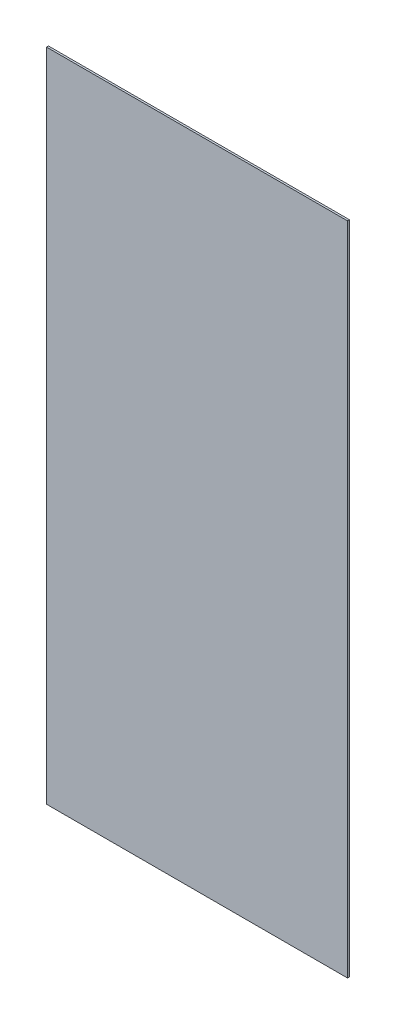
ISO-10303-21;
HEADER;
FILE_DESCRIPTION(('STEP AP214'),'2;1');
FILE_NAME('part.step','',(''),(''),'','','');
FILE_SCHEMA(('AUTOMOTIVE_DESIGN { 1 0 10303 214 1 1 1 1 }'));
ENDSEC;
DATA;
#1=APPLICATION_CONTEXT('core data for automotive mechanical design processes');
#2=APPLICATION_PROTOCOL_DEFINITION('international standard','automotive_design',2000,#1);
#3=PRODUCT_CONTEXT('',#1,'mechanical');
#4=PRODUCT('Part','Part','',(#3));
#5=PRODUCT_RELATED_PRODUCT_CATEGORY('part','',(#4));
#6=PRODUCT_DEFINITION_FORMATION('','',#4);
#7=PRODUCT_DEFINITION_CONTEXT('part definition',#1,'design');
#8=PRODUCT_DEFINITION('design','',#6,#7);
#9=PRODUCT_DEFINITION_SHAPE('','',#8);
#10=(LENGTH_UNIT() NAMED_UNIT(*) SI_UNIT(.MILLI.,.METRE.));
#11=(NAMED_UNIT(*) PLANE_ANGLE_UNIT() SI_UNIT($,.RADIAN.));
#12=(NAMED_UNIT(*) SI_UNIT($,.STERADIAN.) SOLID_ANGLE_UNIT());
#13=UNCERTAINTY_MEASURE_WITH_UNIT(LENGTH_MEASURE(1.E-05),#10,'distance_accuracy_value','');
#14=(GEOMETRIC_REPRESENTATION_CONTEXT(3) GLOBAL_UNCERTAINTY_ASSIGNED_CONTEXT((#13)) GLOBAL_UNIT_ASSIGNED_CONTEXT((#10,
#11,#12)) REPRESENTATION_CONTEXT('',''));
#15=CARTESIAN_POINT('',(0.,0.,0.));
#16=DIRECTION('',(0.,0.,1.));
#17=DIRECTION('',(1.,0.,0.));
#18=AXIS2_PLACEMENT_3D('',#15,#16,#17);
#19=CARTESIAN_POINT('',(0.,0.,5.));
#20=DIRECTION('',(-1.,0.,0.));
#21=DIRECTION('',(0.,0.,1.));
#22=AXIS2_PLACEMENT_3D('',#19,#20,#21);
#23=PLANE('',#22);
#24=DIRECTION('',(0.,1.,0.));
#25=VECTOR('',#24,1.);
#26=CARTESIAN_POINT('',(0.,0.,0.));
#27=LINE('',#26,#25);
#28=CARTESIAN_POINT('',(0.,0.,0.));
#29=VERTEX_POINT('',#28);
#30=CARTESIAN_POINT('',(0.,1700.,0.));
#31=VERTEX_POINT('',#30);
#32=EDGE_CURVE('E98',#29,#31,#27,.T.);
#33=ORIENTED_EDGE('',*,*,#32,.F.);
#34=DIRECTION('',(0.,0.,-1.));
#35=VECTOR('',#34,1.);
#36=CARTESIAN_POINT('',(0.,0.,5.));
#37=LINE('',#36,#35);
#38=CARTESIAN_POINT('',(0.,0.,5.));
#39=VERTEX_POINT('',#38);
#40=EDGE_CURVE('E11',#39,#29,#37,.T.);
#41=ORIENTED_EDGE('',*,*,#40,.F.);
#42=DIRECTION('',(0.,1.,0.));
#43=VECTOR('',#42,1.);
#44=CARTESIAN_POINT('',(0.,0.,5.));
#45=LINE('',#44,#43);
#46=CARTESIAN_POINT('',(0.,1700.,5.));
#47=VERTEX_POINT('',#46);
#48=EDGE_CURVE('E93',#39,#47,#45,.T.);
#49=ORIENTED_EDGE('',*,*,#48,.T.);
#50=DIRECTION('',(0.,0.,-1.));
#51=VECTOR('',#50,1.);
#52=CARTESIAN_POINT('',(0.,1700.,5.));
#53=LINE('',#52,#51);
#54=EDGE_CURVE('E36',#47,#31,#53,.T.);
#55=ORIENTED_EDGE('',*,*,#54,.T.);
#56=EDGE_LOOP('',(#33,#41,#49,#55));
#57=FACE_BOUND('',#56,.T.);
#58=ADVANCED_FACE('F33',(#57),#23,.T.);
#59=CARTESIAN_POINT('',(0.,0.,5.));
#60=DIRECTION('',(0.,1.,0.));
#61=DIRECTION('',(0.,0.,1.));
#62=AXIS2_PLACEMENT_3D('',#59,#60,#61);
#63=PLANE('',#62);
#64=DIRECTION('',(1.,0.,0.));
#65=VECTOR('',#64,1.);
#66=CARTESIAN_POINT('',(0.,0.,0.));
#67=LINE('',#66,#65);
#68=CARTESIAN_POINT('',(780.,0.,0.));
#69=VERTEX_POINT('',#68);
#70=EDGE_CURVE('E66',#29,#69,#67,.T.);
#71=ORIENTED_EDGE('',*,*,#70,.T.);
#72=DIRECTION('',(0.,0.,-1.));
#73=VECTOR('',#72,1.);
#74=CARTESIAN_POINT('',(780.,0.,5.));
#75=LINE('',#74,#73);
#76=CARTESIAN_POINT('',(780.,0.,5.));
#77=VERTEX_POINT('',#76);
#78=EDGE_CURVE('E42',#77,#69,#75,.T.);
#79=ORIENTED_EDGE('',*,*,#78,.F.);
#80=DIRECTION('',(1.,0.,0.));
#81=VECTOR('',#80,1.);
#82=CARTESIAN_POINT('',(0.,0.,5.));
#83=LINE('',#82,#81);
#84=EDGE_CURVE('E83',#39,#77,#83,.T.);
#85=ORIENTED_EDGE('',*,*,#84,.F.);
#86=ORIENTED_EDGE('',*,*,#40,.T.);
#87=EDGE_LOOP('',(#71,#79,#85,#86));
#88=FACE_BOUND('',#87,.T.);
#89=ADVANCED_FACE('F108',(#88),#63,.F.);
#90=CARTESIAN_POINT('',(780.,0.,5.));
#91=DIRECTION('',(-1.,0.,0.));
#92=DIRECTION('',(0.,0.,1.));
#93=AXIS2_PLACEMENT_3D('',#90,#91,#92);
#94=PLANE('',#93);
#95=DIRECTION('',(0.,1.,0.));
#96=VECTOR('',#95,1.);
#97=CARTESIAN_POINT('',(780.,0.,0.));
#98=LINE('',#97,#96);
#99=CARTESIAN_POINT('',(780.,1700.,0.));
#100=VERTEX_POINT('',#99);
#101=EDGE_CURVE('E90',#69,#100,#98,.T.);
#102=ORIENTED_EDGE('',*,*,#101,.T.);
#103=DIRECTION('',(0.,0.,-1.));
#104=VECTOR('',#103,1.);
#105=CARTESIAN_POINT('',(780.,1700.,5.));
#106=LINE('',#105,#104);
#107=CARTESIAN_POINT('',(780.,1700.,5.));
#108=VERTEX_POINT('',#107);
#109=EDGE_CURVE('E87',#108,#100,#106,.T.);
#110=ORIENTED_EDGE('',*,*,#109,.F.);
#111=DIRECTION('',(0.,1.,0.));
#112=VECTOR('',#111,1.);
#113=CARTESIAN_POINT('',(780.,0.,5.));
#114=LINE('',#113,#112);
#115=EDGE_CURVE('E78',#77,#108,#114,.T.);
#116=ORIENTED_EDGE('',*,*,#115,.F.);
#117=ORIENTED_EDGE('',*,*,#78,.T.);
#118=EDGE_LOOP('',(#102,#110,#116,#117));
#119=FACE_BOUND('',#118,.T.);
#120=ADVANCED_FACE('F88',(#119),#94,.F.);
#121=CARTESIAN_POINT('',(0.,1700.,5.));
#122=DIRECTION('',(0.,1.,0.));
#123=DIRECTION('',(0.,0.,1.));
#124=AXIS2_PLACEMENT_3D('',#121,#122,#123);
#125=PLANE('',#124);
#126=DIRECTION('',(1.,0.,0.));
#127=VECTOR('',#126,1.);
#128=CARTESIAN_POINT('',(0.,1700.,0.));
#129=LINE('',#128,#127);
#130=EDGE_CURVE('E101',#31,#100,#129,.T.);
#131=ORIENTED_EDGE('',*,*,#130,.F.);
#132=ORIENTED_EDGE('',*,*,#54,.F.);
#133=DIRECTION('',(1.,0.,0.));
#134=VECTOR('',#133,1.);
#135=CARTESIAN_POINT('',(0.,1700.,5.));
#136=LINE('',#135,#134);
#137=EDGE_CURVE('E82',#47,#108,#136,.T.);
#138=ORIENTED_EDGE('',*,*,#137,.T.);
#139=ORIENTED_EDGE('',*,*,#109,.T.);
#140=EDGE_LOOP('',(#131,#132,#138,#139));
#141=FACE_BOUND('',#140,.T.);
#142=ADVANCED_FACE('F92',(#141),#125,.T.);
#143=CARTESIAN_POINT('',(0.,0.,5.));
#144=DIRECTION('',(0.,0.,-1.));
#145=DIRECTION('',(-1.,0.,0.));
#146=AXIS2_PLACEMENT_3D('',#143,#144,#145);
#147=PLANE('',#146);
#148=ORIENTED_EDGE('',*,*,#48,.F.);
#149=ORIENTED_EDGE('',*,*,#84,.T.);
#150=ORIENTED_EDGE('',*,*,#115,.T.);
#151=ORIENTED_EDGE('',*,*,#137,.F.);
#152=EDGE_LOOP('',(#148,#149,#150,#151));
#153=FACE_BOUND('',#152,.T.);
#154=ADVANCED_FACE('F81',(#153),#147,.F.);
#155=CARTESIAN_POINT('',(0.,0.,0.));
#156=DIRECTION('',(0.,0.,-1.));
#157=DIRECTION('',(-1.,0.,0.));
#158=AXIS2_PLACEMENT_3D('',#155,#156,#157);
#159=PLANE('',#158);
#160=ORIENTED_EDGE('',*,*,#32,.T.);
#161=ORIENTED_EDGE('',*,*,#130,.T.);
#162=ORIENTED_EDGE('',*,*,#101,.F.);
#163=ORIENTED_EDGE('',*,*,#70,.F.);
#164=EDGE_LOOP('',(#160,#161,#162,#163));
#165=FACE_BOUND('',#164,.T.);
#166=ADVANCED_FACE('F106',(#165),#159,.T.);
#167=CLOSED_SHELL('',(#58,#89,#120,#142,#154,#166));
#168=MANIFOLD_SOLID_BREP('B2',#167);
#169=ADVANCED_BREP_SHAPE_REPRESENTATION('',(#18,#168),#14);
#170=SHAPE_DEFINITION_REPRESENTATION(#9,#169);
ENDSEC;
END-ISO-10303-21;
